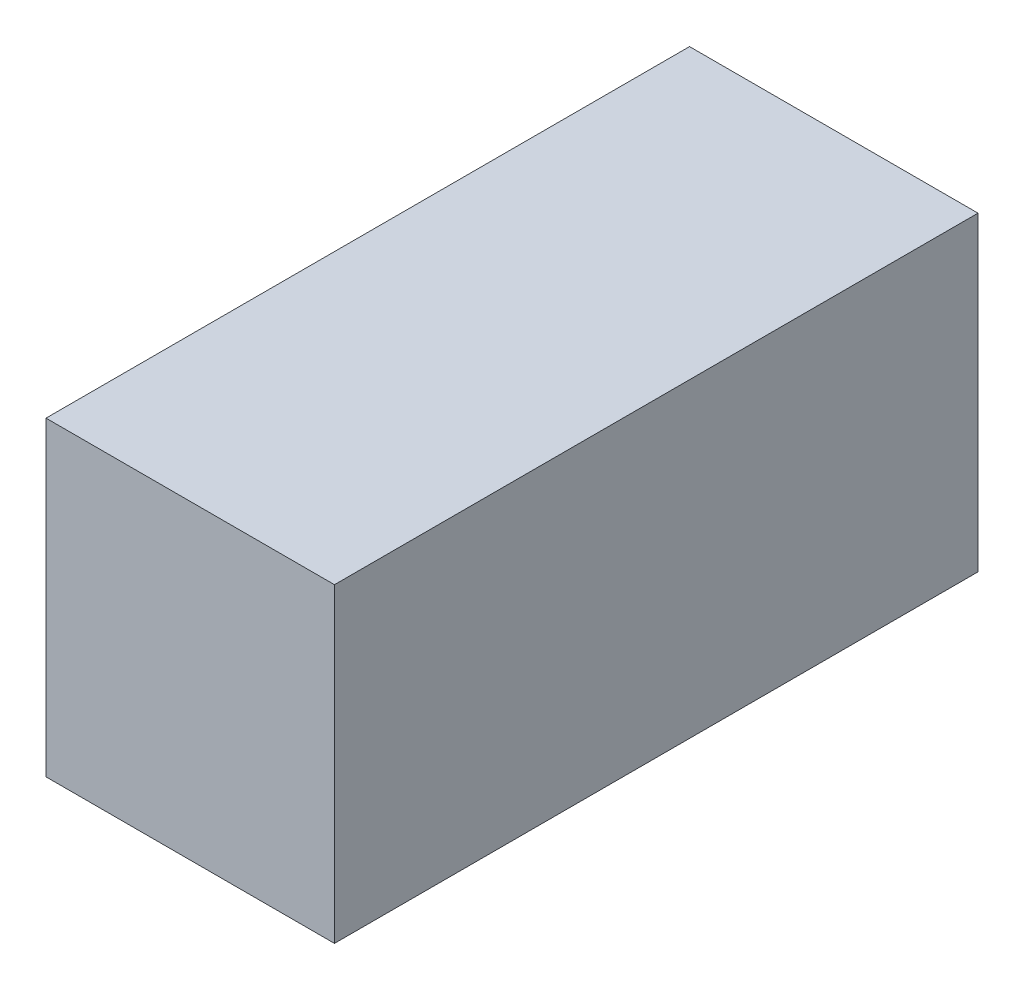
ISO-10303-21;
HEADER;
FILE_DESCRIPTION(('STEP AP214'),'2;1');
FILE_NAME('part.step','',(''),(''),'','','');
FILE_SCHEMA(('AUTOMOTIVE_DESIGN { 1 0 10303 214 1 1 1 1 }'));
ENDSEC;
DATA;
#1=APPLICATION_CONTEXT('core data for automotive mechanical design processes');
#2=APPLICATION_PROTOCOL_DEFINITION('international standard','automotive_design',2000,#1);
#3=PRODUCT_CONTEXT('',#1,'mechanical');
#4=PRODUCT('Part','Part','',(#3));
#5=PRODUCT_RELATED_PRODUCT_CATEGORY('part','',(#4));
#6=PRODUCT_DEFINITION_FORMATION('','',#4);
#7=PRODUCT_DEFINITION_CONTEXT('part definition',#1,'design');
#8=PRODUCT_DEFINITION('design','',#6,#7);
#9=PRODUCT_DEFINITION_SHAPE('','',#8);
#10=(LENGTH_UNIT() NAMED_UNIT(*) SI_UNIT(.MILLI.,.METRE.));
#11=(NAMED_UNIT(*) PLANE_ANGLE_UNIT() SI_UNIT($,.RADIAN.));
#12=(NAMED_UNIT(*) SI_UNIT($,.STERADIAN.) SOLID_ANGLE_UNIT());
#13=UNCERTAINTY_MEASURE_WITH_UNIT(LENGTH_MEASURE(1.E-05),#10,'distance_accuracy_value','');
#14=(GEOMETRIC_REPRESENTATION_CONTEXT(3) GLOBAL_UNCERTAINTY_ASSIGNED_CONTEXT((#13)) GLOBAL_UNIT_ASSIGNED_CONTEXT((#10,
#11,#12)) REPRESENTATION_CONTEXT('',''));
#15=CARTESIAN_POINT('',(0.,0.,0.));
#16=DIRECTION('',(0.,0.,1.));
#17=DIRECTION('',(1.,0.,0.));
#18=AXIS2_PLACEMENT_3D('',#15,#16,#17);
#19=CARTESIAN_POINT('',(47.5018689229045,-38.6513954716684,174.));
#20=DIRECTION('',(-1.,0.,0.));
#21=DIRECTION('',(0.,0.,1.));
#22=AXIS2_PLACEMENT_3D('',#19,#20,#21);
#23=PLANE('',#22);
#24=DIRECTION('',(0.,1.,0.));
#25=VECTOR('',#24,1.);
#26=CARTESIAN_POINT('',(47.5018689229045,-38.6513954716684,0.));
#27=LINE('',#26,#25);
#28=CARTESIAN_POINT('',(47.5018689229045,-38.6513954716684,0.));
#29=VERTEX_POINT('',#28);
#30=CARTESIAN_POINT('',(47.5018689229045,45.3486045283316,0.));
#31=VERTEX_POINT('',#30);
#32=EDGE_CURVE('E96',#29,#31,#27,.T.);
#33=ORIENTED_EDGE('',*,*,#32,.T.);
#34=DIRECTION('',(0.,0.,-1.));
#35=VECTOR('',#34,1.);
#36=CARTESIAN_POINT('',(47.5018689229045,45.3486045283316,174.));
#37=LINE('',#36,#35);
#38=CARTESIAN_POINT('',(47.5018689229045,45.3486045283316,174.));
#39=VERTEX_POINT('',#38);
#40=EDGE_CURVE('E11',#39,#31,#37,.T.);
#41=ORIENTED_EDGE('',*,*,#40,.F.);
#42=DIRECTION('',(0.,1.,0.));
#43=VECTOR('',#42,1.);
#44=CARTESIAN_POINT('',(47.5018689229045,-38.6513954716684,174.));
#45=LINE('',#44,#43);
#46=CARTESIAN_POINT('',(47.5018689229045,-38.6513954716684,174.));
#47=VERTEX_POINT('',#46);
#48=EDGE_CURVE('E84',#47,#39,#45,.T.);
#49=ORIENTED_EDGE('',*,*,#48,.F.);
#50=DIRECTION('',(0.,0.,-1.));
#51=VECTOR('',#50,1.);
#52=CARTESIAN_POINT('',(47.5018689229045,-38.6513954716684,174.));
#53=LINE('',#52,#51);
#54=EDGE_CURVE('E92',#47,#29,#53,.T.);
#55=ORIENTED_EDGE('',*,*,#54,.T.);
#56=EDGE_LOOP('',(#33,#41,#49,#55));
#57=FACE_BOUND('',#56,.T.);
#58=ADVANCED_FACE('F33',(#57),#23,.F.);
#59=CARTESIAN_POINT('',(-30.4981310770955,45.3486045283316,174.));
#60=DIRECTION('',(0.,-1.,0.));
#61=DIRECTION('',(0.,0.,-1.));
#62=AXIS2_PLACEMENT_3D('',#59,#60,#61);
#63=PLANE('',#62);
#64=DIRECTION('',(-1.,0.,0.));
#65=VECTOR('',#64,1.);
#66=CARTESIAN_POINT('',(-30.4981310770955,45.3486045283316,0.));
#67=LINE('',#66,#65);
#68=CARTESIAN_POINT('',(-30.4981310770955,45.3486045283316,0.));
#69=VERTEX_POINT('',#68);
#70=EDGE_CURVE('E88',#31,#69,#67,.T.);
#71=ORIENTED_EDGE('',*,*,#70,.T.);
#72=DIRECTION('',(0.,0.,-1.));
#73=VECTOR('',#72,1.);
#74=CARTESIAN_POINT('',(-30.4981310770955,45.3486045283316,174.));
#75=LINE('',#74,#73);
#76=CARTESIAN_POINT('',(-30.4981310770955,45.3486045283316,174.));
#77=VERTEX_POINT('',#76);
#78=EDGE_CURVE('E41',#77,#69,#75,.T.);
#79=ORIENTED_EDGE('',*,*,#78,.F.);
#80=DIRECTION('',(-1.,0.,0.));
#81=VECTOR('',#80,1.);
#82=CARTESIAN_POINT('',(-30.4981310770955,45.3486045283316,174.));
#83=LINE('',#82,#81);
#84=EDGE_CURVE('E79',#39,#77,#83,.T.);
#85=ORIENTED_EDGE('',*,*,#84,.F.);
#86=ORIENTED_EDGE('',*,*,#40,.T.);
#87=EDGE_LOOP('',(#71,#79,#85,#86));
#88=FACE_BOUND('',#87,.T.);
#89=ADVANCED_FACE('F87',(#88),#63,.F.);
#90=CARTESIAN_POINT('',(-30.4981310770955,-38.6513954716684,174.));
#91=DIRECTION('',(1.,0.,0.));
#92=DIRECTION('',(0.,0.,-1.));
#93=AXIS2_PLACEMENT_3D('',#90,#91,#92);
#94=PLANE('',#93);
#95=DIRECTION('',(0.,-1.,0.));
#96=VECTOR('',#95,1.);
#97=CARTESIAN_POINT('',(-30.4981310770955,-38.6513954716684,0.));
#98=LINE('',#97,#96);
#99=CARTESIAN_POINT('',(-30.4981310770955,-38.6513954716684,0.));
#100=VERTEX_POINT('',#99);
#101=EDGE_CURVE('E66',#69,#100,#98,.T.);
#102=ORIENTED_EDGE('',*,*,#101,.T.);
#103=DIRECTION('',(0.,0.,-1.));
#104=VECTOR('',#103,1.);
#105=CARTESIAN_POINT('',(-30.4981310770955,-38.6513954716684,174.));
#106=LINE('',#105,#104);
#107=CARTESIAN_POINT('',(-30.4981310770955,-38.6513954716684,174.));
#108=VERTEX_POINT('',#107);
#109=EDGE_CURVE('E89',#108,#100,#106,.T.);
#110=ORIENTED_EDGE('',*,*,#109,.F.);
#111=DIRECTION('',(0.,-1.,0.));
#112=VECTOR('',#111,1.);
#113=CARTESIAN_POINT('',(-30.4981310770955,-38.6513954716684,174.));
#114=LINE('',#113,#112);
#115=EDGE_CURVE('E82',#77,#108,#114,.T.);
#116=ORIENTED_EDGE('',*,*,#115,.F.);
#117=ORIENTED_EDGE('',*,*,#78,.T.);
#118=EDGE_LOOP('',(#102,#110,#116,#117));
#119=FACE_BOUND('',#118,.T.);
#120=ADVANCED_FACE('F90',(#119),#94,.F.);
#121=CARTESIAN_POINT('',(-30.4981310770955,-38.6513954716684,174.));
#122=DIRECTION('',(0.,1.,0.));
#123=DIRECTION('',(0.,0.,1.));
#124=AXIS2_PLACEMENT_3D('',#121,#122,#123);
#125=PLANE('',#124);
#126=DIRECTION('',(1.,0.,0.));
#127=VECTOR('',#126,1.);
#128=CARTESIAN_POINT('',(-30.4981310770955,-38.6513954716684,0.));
#129=LINE('',#128,#127);
#130=EDGE_CURVE('E72',#100,#29,#129,.T.);
#131=ORIENTED_EDGE('',*,*,#130,.T.);
#132=ORIENTED_EDGE('',*,*,#54,.F.);
#133=DIRECTION('',(1.,0.,0.));
#134=VECTOR('',#133,1.);
#135=CARTESIAN_POINT('',(-30.4981310770955,-38.6513954716684,174.));
#136=LINE('',#135,#134);
#137=EDGE_CURVE('E49',#108,#47,#136,.T.);
#138=ORIENTED_EDGE('',*,*,#137,.F.);
#139=ORIENTED_EDGE('',*,*,#109,.T.);
#140=EDGE_LOOP('',(#131,#132,#138,#139));
#141=FACE_BOUND('',#140,.T.);
#142=ADVANCED_FACE('F103',(#141),#125,.F.);
#143=CARTESIAN_POINT('',(0.,0.,174.));
#144=DIRECTION('',(0.,0.,-1.));
#145=DIRECTION('',(-1.,0.,0.));
#146=AXIS2_PLACEMENT_3D('',#143,#144,#145);
#147=PLANE('',#146);
#148=ORIENTED_EDGE('',*,*,#48,.T.);
#149=ORIENTED_EDGE('',*,*,#84,.T.);
#150=ORIENTED_EDGE('',*,*,#115,.T.);
#151=ORIENTED_EDGE('',*,*,#137,.T.);
#152=EDGE_LOOP('',(#148,#149,#150,#151));
#153=FACE_BOUND('',#152,.T.);
#154=ADVANCED_FACE('F80',(#153),#147,.F.);
#155=CARTESIAN_POINT('',(0.,0.,0.));
#156=DIRECTION('',(0.,0.,-1.));
#157=DIRECTION('',(-1.,0.,0.));
#158=AXIS2_PLACEMENT_3D('',#155,#156,#157);
#159=PLANE('',#158);
#160=ORIENTED_EDGE('',*,*,#32,.F.);
#161=ORIENTED_EDGE('',*,*,#130,.F.);
#162=ORIENTED_EDGE('',*,*,#101,.F.);
#163=ORIENTED_EDGE('',*,*,#70,.F.);
#164=EDGE_LOOP('',(#160,#161,#162,#163));
#165=FACE_BOUND('',#164,.T.);
#166=ADVANCED_FACE('F106',(#165),#159,.T.);
#167=CLOSED_SHELL('',(#58,#89,#120,#142,#154,#166));
#168=MANIFOLD_SOLID_BREP('B2',#167);
#169=ADVANCED_BREP_SHAPE_REPRESENTATION('',(#18,#168),#14);
#170=SHAPE_DEFINITION_REPRESENTATION(#9,#169);
ENDSEC;
END-ISO-10303-21;
